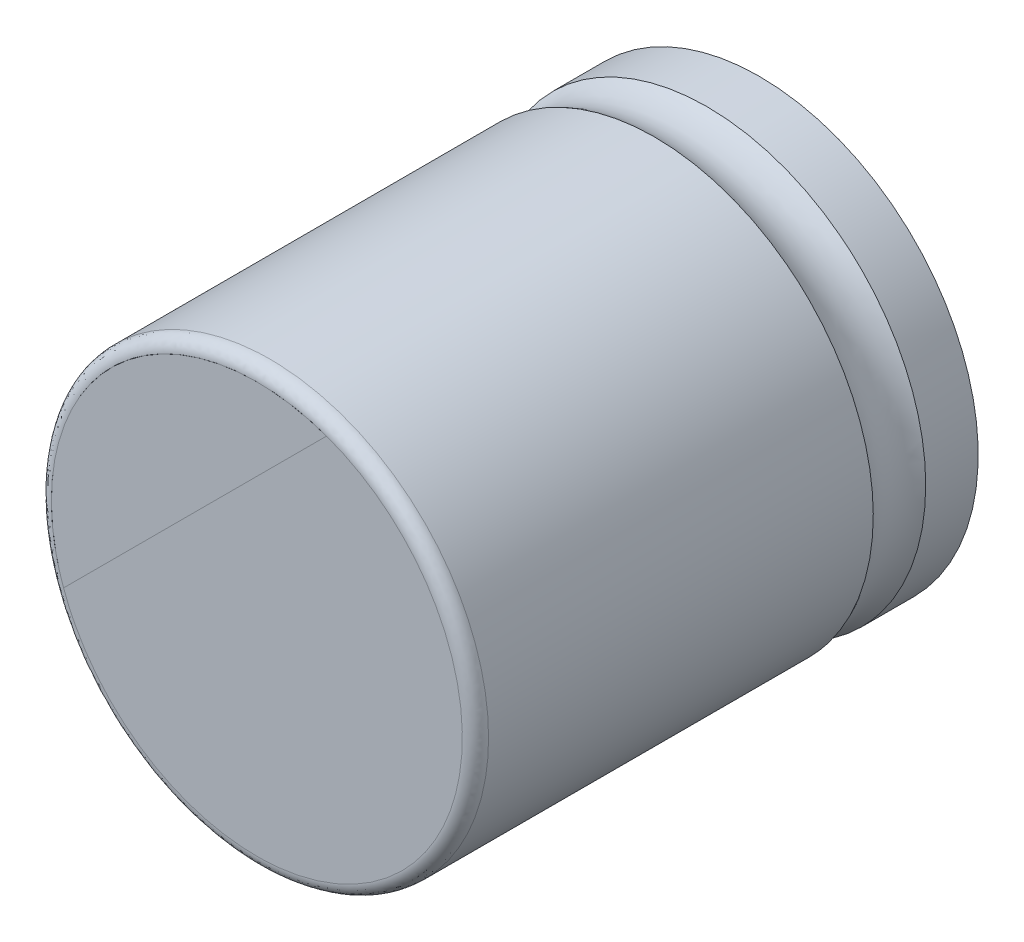
ISO-10303-21;
HEADER;
FILE_DESCRIPTION(('STEP AP214'),'2;1');
FILE_NAME('part.step','',(''),(''),'','','');
FILE_SCHEMA(('AUTOMOTIVE_DESIGN { 1 0 10303 214 1 1 1 1 }'));
ENDSEC;
DATA;
#1=APPLICATION_CONTEXT('core data for automotive mechanical design processes');
#2=APPLICATION_PROTOCOL_DEFINITION('international standard','automotive_design',2000,#1);
#3=PRODUCT_CONTEXT('',#1,'mechanical');
#4=PRODUCT('Part','Part','',(#3));
#5=PRODUCT_RELATED_PRODUCT_CATEGORY('part','',(#4));
#6=PRODUCT_DEFINITION_FORMATION('','',#4);
#7=PRODUCT_DEFINITION_CONTEXT('part definition',#1,'design');
#8=PRODUCT_DEFINITION('design','',#6,#7);
#9=PRODUCT_DEFINITION_SHAPE('','',#8);
#10=(LENGTH_UNIT() NAMED_UNIT(*) SI_UNIT(.MILLI.,.METRE.));
#11=(NAMED_UNIT(*) PLANE_ANGLE_UNIT() SI_UNIT($,.RADIAN.));
#12=(NAMED_UNIT(*) SI_UNIT($,.STERADIAN.) SOLID_ANGLE_UNIT());
#13=UNCERTAINTY_MEASURE_WITH_UNIT(LENGTH_MEASURE(1.E-05),#10,'distance_accuracy_value','');
#14=(GEOMETRIC_REPRESENTATION_CONTEXT(3) GLOBAL_UNCERTAINTY_ASSIGNED_CONTEXT((#13)) GLOBAL_UNIT_ASSIGNED_CONTEXT((#10,
#11,#12)) REPRESENTATION_CONTEXT('',''));
#15=CARTESIAN_POINT('',(0.,0.,0.));
#16=DIRECTION('',(0.,0.,1.));
#17=DIRECTION('',(1.,0.,0.));
#18=AXIS2_PLACEMENT_3D('',#15,#16,#17);
#19=CARTESIAN_POINT('',(-22.9845204221404,-6.4473216376947,14.5513158732941));
#20=CARTESIAN_POINT('',(-25.791467133841,-5.43589173098784,14.5513159287911));
#21=CARTESIAN_POINT('',(-27.9011993797086,-7.54562397685555,14.551316059209));
#22=CARTESIAN_POINT('',(-30.0109316255764,-9.65535622272346,14.5513161896269));
#23=CARTESIAN_POINT('',(-28.9995017188693,-12.4623029344242,14.5513162451239));
#24=CARTESIAN_POINT('',(-22.9845204221714,-6.44732163772561,14.5503158732941));
#25=CARTESIAN_POINT('',(-25.7914671338719,-5.43589173101874,14.5503159287911));
#26=CARTESIAN_POINT('',(-27.9011993797395,-7.54562397688646,14.5503160592089));
#27=CARTESIAN_POINT('',(-30.0109316256073,-9.65535622275437,14.5503161896268));
#28=CARTESIAN_POINT('',(-28.9995017189002,-12.4623029344551,14.5503162451238));
#29=(BOUNDED_SURFACE() B_SPLINE_SURFACE(1,2,((#19,#20,#21,#22,#23),(#24,#25,#26,#27,#28)),
.UNSPECIFIED.,.F.,.F.,.F.) B_SPLINE_SURFACE_WITH_KNOTS((2,2),(3,2,3),(0.425531914893605,
0.425744680851065),(-1.13124673434671,0.,1.13124673434683),
.UNSPECIFIED.) GEOMETRIC_REPRESENTATION_ITEM() RATIONAL_B_SPLINE_SURFACE(((1.,0.844254675703242,
1.,0.844254675703242,1.),(1.,0.844254675703242,1.,0.844254675703242,1.))) REPRESENTATION_ITEM('') SURFACE());
#30=CARTESIAN_POINT('',(-28.9995017189001,-12.4623029344551,14.5503162451239));
#31=CARTESIAN_POINT('',(-29.2777975081627,-11.6899691865893,14.5503162298538));
#32=CARTESIAN_POINT('',(-29.2777975081627,-10.8690258484632,14.5503162044796));
#33=(BOUNDED_CURVE() B_SPLINE_CURVE(2,(#30,#31,#32),.UNSPECIFIED.,.F.,
.F.) B_SPLINE_CURVE_WITH_KNOTS((3,3),(-0.345848570949383,0.),
.UNSPECIFIED.) CURVE() GEOMETRIC_REPRESENTATION_ITEM() RATIONAL_B_SPLINE_CURVE((1.,
0.985085816044448,1.)) REPRESENTATION_ITEM(''));
#34=CARTESIAN_POINT('',(-28.9995017189001,-12.4623029344551,14.5503162451238));
#35=VERTEX_POINT('',#34);
#36=CARTESIAN_POINT('',(-29.2777975081627,-10.8690258484632,14.5503162044796));
#37=VERTEX_POINT('',#36);
#38=EDGE_CURVE('E156',#35,#37,#33,.T.);
#39=CARTESIAN_POINT('',(-28.9995017189,-12.4623029344543,14.5503162451238));
#40=CARTESIAN_POINT('',(-28.9995017188691,-12.4623029344234,14.5513162451238));
#41=(BOUNDED_CURVE() B_SPLINE_CURVE(1,(#39,#40),.UNSPECIFIED.,.F.,
.F.) B_SPLINE_CURVE_WITH_KNOTS((2,2),(0.0019999999999999,0.0020009999999999),
.UNSPECIFIED.) CURVE() GEOMETRIC_REPRESENTATION_ITEM() RATIONAL_B_SPLINE_CURVE((1.,1.)) REPRESENTATION_ITEM(''));
#42=CARTESIAN_POINT('',(-28.9995017188691,-12.4623029344235,14.5513162451238));
#43=VERTEX_POINT('',#42);
#44=EDGE_CURVE('E11',#35,#43,#41,.T.);
#45=CARTESIAN_POINT('',(-22.9845204221406,-6.44732163769462,14.5513158732941));
#46=CARTESIAN_POINT('',(-25.7914671338411,-5.43589173098797,14.5513159287911));
#47=CARTESIAN_POINT('',(-27.9011993797086,-7.54562397685556,14.551316059209));
#48=CARTESIAN_POINT('',(-30.0109316255762,-9.65535622272316,14.5513161896269));
#49=CARTESIAN_POINT('',(-28.9995017188694,-12.4623029344236,14.5513162451239));
#50=(BOUNDED_CURVE() B_SPLINE_CURVE(2,(#45,#46,#47,#48,#49),.UNSPECIFIED.,.F.,
.F.) B_SPLINE_CURVE_WITH_KNOTS((3,2,3),(1.22494775584567,2.35619449019236,3.48744122453904),
.UNSPECIFIED.) CURVE() GEOMETRIC_REPRESENTATION_ITEM() RATIONAL_B_SPLINE_CURVE((1.,
0.844254675703262,1.,0.844254675703267,1.)) REPRESENTATION_ITEM(''));
#51=CARTESIAN_POINT('',(-22.9845204221407,-6.44732163769495,14.5513158732941));
#52=VERTEX_POINT('',#51);
#53=EDGE_CURVE('E121',#52,#43,#50,.T.);
#54=CARTESIAN_POINT('',(-22.9845204221715,-6.44732163772585,14.5503158732941));
#55=CARTESIAN_POINT('',(-22.9845204221406,-6.44732163769494,14.5513158732941));
#56=(BOUNDED_CURVE() B_SPLINE_CURVE(1,(#54,#55),.UNSPECIFIED.,.F.,
.F.) B_SPLINE_CURVE_WITH_KNOTS((2,2),(0.002,0.002001),
.UNSPECIFIED.) CURVE() GEOMETRIC_REPRESENTATION_ITEM() RATIONAL_B_SPLINE_CURVE((1.,1.)) REPRESENTATION_ITEM(''));
#57=CARTESIAN_POINT('',(-22.9845204221714,-6.44732163772573,14.5503158732941));
#58=VERTEX_POINT('',#57);
#59=EDGE_CURVE('E31',#58,#52,#56,.T.);
#60=CARTESIAN_POINT('',(-29.2777975081627,-10.8690258484632,14.5503162044796));
#61=CARTESIAN_POINT('',(-29.2777975081627,-8.42716342895958,14.5503161290049));
#62=CARTESIAN_POINT('',(-27.2797965547799,-7.02335280566826,14.5503160238596));
#63=CARTESIAN_POINT('',(-25.2817956013971,-5.61954218237694,14.5503159187142));
#64=CARTESIAN_POINT('',(-22.9845204221713,-6.44732163772557,14.5503158732941));
#65=(BOUNDED_CURVE() B_SPLINE_CURVE(2,(#60,#61,#62,#63,#64),.UNSPECIFIED.,.F.,
.F.) B_SPLINE_CURVE_WITH_KNOTS((3,2,3),(0.,0.958322448872076,1.91664489774415),
.UNSPECIFIED.) CURVE() GEOMETRIC_REPRESENTATION_ITEM() RATIONAL_B_SPLINE_CURVE((1.,
0.887381939802098,1.,0.887381939802095,1.)) REPRESENTATION_ITEM(''));
#66=EDGE_CURVE('E189',#37,#58,#65,.T.);
#67=ORIENTED_EDGE('',*,*,#38,.F.);
#68=ORIENTED_EDGE('',*,*,#44,.T.);
#69=ORIENTED_EDGE('',*,*,#53,.F.);
#70=ORIENTED_EDGE('',*,*,#59,.F.);
#71=ORIENTED_EDGE('',*,*,#66,.F.);
#72=EDGE_LOOP('',(#67,#68,#69,#70,#71));
#73=FACE_BOUND('',#72,.T.);
#74=ADVANCED_FACE('F17',(#73),#29,.T.);
#75=CARTESIAN_POINT('',(-29.6009998485764,-13.0638010641307,14.5502162823068));
#76=CARTESIAN_POINT('',(-29.6009998485394,-13.0638010640937,14.5514162823068));
#77=CARTESIAN_POINT('',(-22.3830222925016,-5.8458235080559,14.5502158361111));
#78=CARTESIAN_POINT('',(-22.3830222924645,-5.84582350801881,14.5514158361112));
#79=(BOUNDED_SURFACE() B_SPLINE_SURFACE(1,1,((#75,#76),(#77,#78)),.UNSPECIFIED.,.F.,.F.,
.F.) B_SPLINE_SURFACE_WITH_KNOTS((2,2),(2,2),(-0.000850646812726065,0.0093571149399796),
(0.00199989999999989,0.00200109999999997),
.UNSPECIFIED.) GEOMETRIC_REPRESENTATION_ITEM() RATIONAL_B_SPLINE_SURFACE(((1.,1.),(1.,1.))) REPRESENTATION_ITEM('') SURFACE());
#80=CARTESIAN_POINT('',(-22.9845204221714,-6.44732163772572,14.5503158732941));
#81=CARTESIAN_POINT('',(-28.9995017189004,-12.4623029344547,14.5503162451238));
#82=(BOUNDED_CURVE() B_SPLINE_CURVE(1,(#80,#81),.UNSPECIFIED.,.F.,
.F.) B_SPLINE_CURVE_WITH_KNOTS((2,2),(-0.00850646812725422,0.),
.UNSPECIFIED.) CURVE() GEOMETRIC_REPRESENTATION_ITEM() RATIONAL_B_SPLINE_CURVE((1.,1.)) REPRESENTATION_ITEM(''));
#83=EDGE_CURVE('E122',#58,#35,#82,.T.);
#84=CARTESIAN_POINT('',(-28.9995017188691,-12.4623029344234,14.5513162451239));
#85=CARTESIAN_POINT('',(-22.9845204221407,-6.44732163769497,14.5513158732941));
#86=(BOUNDED_CURVE() B_SPLINE_CURVE(1,(#84,#85),.UNSPECIFIED.,.F.,
.F.) B_SPLINE_CURVE_WITH_KNOTS((2,2),(-0.00425323406362698,0.00425323406362695),
.UNSPECIFIED.) CURVE() GEOMETRIC_REPRESENTATION_ITEM() RATIONAL_B_SPLINE_CURVE((1.,1.)) REPRESENTATION_ITEM(''));
#87=EDGE_CURVE('E112',#43,#52,#86,.T.);
#88=ORIENTED_EDGE('',*,*,#83,.F.);
#89=ORIENTED_EDGE('',*,*,#59,.T.);
#90=ORIENTED_EDGE('',*,*,#87,.F.);
#91=ORIENTED_EDGE('',*,*,#44,.F.);
#92=EDGE_LOOP('',(#88,#89,#90,#91));
#93=FACE_BOUND('',#92,.T.);
#94=ADVANCED_FACE('F175',(#93),#79,.T.);
#95=CARTESIAN_POINT('',(-29.4100810176219,-13.2547198950169,14.5513162823068));
#96=CARTESIAN_POINT('',(-31.7011069886663,-10.9636939239725,14.5513162823068));
#97=CARTESIAN_POINT('',(-22.1921034615472,-6.03674233894222,14.5513158361112));
#98=CARTESIAN_POINT('',(-24.4831294325916,-3.74571636789779,14.5513158361112));
#99=(BOUNDED_SURFACE() B_SPLINE_SURFACE(1,1,((#95,#96),(#97,#98)),.UNSPECIFIED.,.F.,.F.,
.F.) B_SPLINE_SURFACE_WITH_KNOTS((2,2),(2,2),(-0.00510388087635276,0.00510388087635273),
(-0.001121530868032,0.00211846913196803),
.UNSPECIFIED.) GEOMETRIC_REPRESENTATION_ITEM() RATIONAL_B_SPLINE_SURFACE(((1.,1.),(1.,1.))) REPRESENTATION_ITEM('') SURFACE());
#100=ORIENTED_EDGE('',*,*,#87,.T.);
#101=ORIENTED_EDGE('',*,*,#53,.T.);
#102=EDGE_LOOP('',(#100,#101));
#103=FACE_BOUND('',#102,.T.);
#104=ADVANCED_FACE('F174',(#103),#99,.T.);
#105=CARTESIAN_POINT('',(-24.6072322844941,-20.5101500175862,14.5503163581128));
#106=CARTESIAN_POINT('',(-31.3927503849693,-13.724631917111,14.5503163581128));
#107=CARTESIAN_POINT('',(-14.9366733390395,-10.8395910721317,14.5503157603052));
#108=CARTESIAN_POINT('',(-21.7221914395147,-4.05407297165644,14.5503157603052));
#109=(BOUNDED_SURFACE() B_SPLINE_SURFACE(1,1,((#105,#106),(#107,#108)),.UNSPECIFIED.,.F.,.F.,
.F.) B_SPLINE_SURFACE_WITH_KNOTS((2,2),(2,2),(-0.00683811780819507,0.00683811780819527),
(-0.00964802161633376,-5.18498909135971E-05),
.UNSPECIFIED.) GEOMETRIC_REPRESENTATION_ITEM() RATIONAL_B_SPLINE_SURFACE(((1.,1.),(1.,1.))) REPRESENTATION_ITEM('') SURFACE());
#110=CARTESIAN_POINT('',(-22.9845204221713,-6.44732163772557,14.5503158732941));
#111=CARTESIAN_POINT('',(-19.4805768587286,-7.70990111481567,14.5503158040166));
#112=CARTESIAN_POINT('',(-19.9089947561008,-11.4096559089841,14.5503159316128));
#113=CARTESIAN_POINT('',(-20.3374126534729,-15.1094107031525,14.550316059209));
#114=CARTESIAN_POINT('',(-24.0371674476412,-15.5378286005251,14.5503161868052));
#115=CARTESIAN_POINT('',(-27.7369222418096,-15.9662464978977,14.5503163144014));
#116=CARTESIAN_POINT('',(-28.9995017189001,-12.4623029344551,14.5503162451239));
#117=(BOUNDED_CURVE() B_SPLINE_CURVE(2,(#110,#111,#112,#113,#114,#115,#116),.UNSPECIFIED.,.F.,
.F.) B_SPLINE_CURVE_WITH_KNOTS((3,2,2,3),(-1.22494775584564,0.115282856983045,1.45551346981173,
2.79574408264041),
.UNSPECIFIED.) CURVE() GEOMETRIC_REPRESENTATION_ITEM() RATIONAL_B_SPLINE_CURVE((1.,
0.783750057002811,1.,0.783750057002807,1.,0.783750057002809,1.)) REPRESENTATION_ITEM(''));
#118=EDGE_CURVE('E23',#58,#35,#117,.T.);
#119=ORIENTED_EDGE('',*,*,#83,.T.);
#120=ORIENTED_EDGE('',*,*,#118,.F.);
#121=EDGE_LOOP('',(#119,#120));
#122=FACE_BOUND('',#121,.T.);
#123=ADVANCED_FACE('F180',(#122),#109,.T.);
#124=CARTESIAN_POINT('',(-29.2777975081627,-10.8690258484632,14.5503162044796));
#125=CARTESIAN_POINT('',(-29.2777975081627,-15.5690258484632,14.5503163497502));
#126=CARTESIAN_POINT('',(-24.5777975081627,-15.5690258484632,14.5503162044796));
#127=CARTESIAN_POINT('',(-19.8777975081627,-15.5690258484632,14.550316059209));
#128=CARTESIAN_POINT('',(-19.8777975081627,-10.8690258484632,14.5503159139384));
#129=CARTESIAN_POINT('',(-19.8777975081627,-6.16902584846323,14.5503157686678));
#130=CARTESIAN_POINT('',(-24.5777975081627,-6.16902584846323,14.5503159139384));
#131=CARTESIAN_POINT('',(-29.2777975081627,-6.16902584846323,14.550316059209));
#132=CARTESIAN_POINT('',(-29.2777975081627,-10.8690258484632,14.5503162044796));
#133=CARTESIAN_POINT('',(-29.5777975081627,-10.8690258484632,14.5503162137522));
#134=CARTESIAN_POINT('',(-29.5777975081627,-15.8690258484632,14.5503163682954));
#135=CARTESIAN_POINT('',(-24.5777975081627,-15.8690258484632,14.5503162137522));
#136=CARTESIAN_POINT('',(-19.5777975081627,-15.8690258484632,14.550316059209));
#137=CARTESIAN_POINT('',(-19.5777975081627,-10.8690258484632,14.5503159046658));
#138=CARTESIAN_POINT('',(-19.5777975081627,-5.86902584846321,14.5503157501227));
#139=CARTESIAN_POINT('',(-24.5777975081627,-5.86902584846321,14.5503159046658));
#140=CARTESIAN_POINT('',(-29.5777975081627,-5.86902584846321,14.550316059209));
#141=CARTESIAN_POINT('',(-29.5777975081627,-10.8690258484632,14.5503162137522));
#142=CARTESIAN_POINT('',(-29.5777975174353,-10.8690258577358,14.2503162137522));
#143=CARTESIAN_POINT('',(-29.5777975174353,-15.8690258577358,14.2503163682953));
#144=CARTESIAN_POINT('',(-24.5777975174353,-15.8690258577358,14.2503162137522));
#145=CARTESIAN_POINT('',(-19.5777975174353,-15.8690258577358,14.250316059209));
#146=CARTESIAN_POINT('',(-19.5777975174353,-10.8690258577358,14.2503159046658));
#147=CARTESIAN_POINT('',(-19.5777975174353,-5.8690258577358,14.2503157501227));
#148=CARTESIAN_POINT('',(-24.5777975174353,-5.8690258577358,14.2503159046658));
#149=CARTESIAN_POINT('',(-29.5777975174353,-5.8690258577358,14.250316059209));
#150=CARTESIAN_POINT('',(-29.5777975174353,-10.8690258577358,14.2503162137522));
#151=(BOUNDED_SURFACE() B_SPLINE_SURFACE(2,2,((#124,#125,#126,#127,#128,#129,#130,#131,#132),
(#133,#134,#135,#136,#137,#138,#139,#140,#141),(#142,#143,#144,#145,#146,#147,#148,#149,#150)),
.UNSPECIFIED.,.F.,.T.,.F.) B_SPLINE_SURFACE_WITH_KNOTS((3,3),(3,2,2,2,3),(0.,1.57079632679494),
(-3.14159265358979,-1.5707963267949,0.,1.5707963267949,3.14159265358979),
.UNSPECIFIED.) GEOMETRIC_REPRESENTATION_ITEM() RATIONAL_B_SPLINE_SURFACE(((1.,0.707106781186548,
1.,0.707106781186548,1.,0.707106781186548,1.,0.707106781186548,1.),(0.707106781186524,
0.499999999999984,0.707106781186524,0.499999999999984,0.707106781186524,0.499999999999984,
0.707106781186524,0.499999999999984,0.707106781186524),(1.,0.707106781186548,1.,
0.707106781186548,1.,0.707106781186548,1.,0.707106781186548,1.))) REPRESENTATION_ITEM('') SURFACE());
#152=CARTESIAN_POINT('',(-29.2777975081627,-10.8690258484632,14.5503162044796));
#153=CARTESIAN_POINT('',(-29.5777975081627,-10.8690258484632,14.5503162137522));
#154=CARTESIAN_POINT('',(-29.5777975174353,-10.8690258577358,14.2503162137522));
#155=(BOUNDED_CURVE() B_SPLINE_CURVE(2,(#152,#153,#154),.UNSPECIFIED.,.F.,
.F.) B_SPLINE_CURVE_WITH_KNOTS((3,3),(-1.57079632679494,0.),
.UNSPECIFIED.) CURVE() GEOMETRIC_REPRESENTATION_ITEM() RATIONAL_B_SPLINE_CURVE((1.,
0.707106781186524,1.)) REPRESENTATION_ITEM(''));
#156=CARTESIAN_POINT('',(-29.5777975174353,-10.8690258577358,14.2503162137522));
#157=VERTEX_POINT('',#156);
#158=EDGE_CURVE('E192',#37,#157,#155,.T.);
#159=CARTESIAN_POINT('',(-29.5777975174353,-10.8690258577358,14.2503162137522));
#160=CARTESIAN_POINT('',(-29.5777975174353,-14.2099190473323,14.2503163170146));
#161=CARTESIAN_POINT('',(-26.4912146792607,-15.4884235202922,14.2503162611294));
#162=CARTESIAN_POINT('',(-23.4046318410862,-16.7669279932522,14.2503162052442));
#163=CARTESIAN_POINT('',(-21.0422636115025,-14.4045597636685,14.250316059209));
#164=(BOUNDED_CURVE() B_SPLINE_CURVE(2,(#159,#160,#161,#162,#163),.UNSPECIFIED.,.F.,
.F.) B_SPLINE_CURVE_WITH_KNOTS((3,2,3),(3.14159265358979,4.31968989868597,5.49778714378215),
.UNSPECIFIED.) CURVE() GEOMETRIC_REPRESENTATION_ITEM() RATIONAL_B_SPLINE_CURVE((1.,
0.831469612302543,1.,0.831469612302544,1.)) REPRESENTATION_ITEM(''));
#165=CARTESIAN_POINT('',(-21.0422636115025,-14.4045597636685,14.250316059209));
#166=VERTEX_POINT('',#165);
#167=EDGE_CURVE('E130',#157,#166,#164,.T.);
#168=CARTESIAN_POINT('',(-21.0422636115025,-14.4045597636685,14.250316059209));
#169=CARTESIAN_POINT('',(-19.5777975174353,-12.9400936696013,14.2503159686797));
#170=CARTESIAN_POINT('',(-19.5777975174353,-10.8690258577358,14.2503159046658));
#171=(BOUNDED_CURVE() B_SPLINE_CURVE(2,(#168,#169,#170),.UNSPECIFIED.,.F.,
.F.) B_SPLINE_CURVE_WITH_KNOTS((3,3),(5.49778714378215,6.28318530717959),
.UNSPECIFIED.) CURVE() GEOMETRIC_REPRESENTATION_ITEM() RATIONAL_B_SPLINE_CURVE((1.,
0.923879532511279,1.)) REPRESENTATION_ITEM(''));
#172=CARTESIAN_POINT('',(-19.5777975174353,-10.8690258577358,14.2503159046658));
#173=VERTEX_POINT('',#172);
#174=EDGE_CURVE('E148',#166,#173,#171,.T.);
#175=CARTESIAN_POINT('',(-19.5777975174353,-10.8690258577358,14.2503159046658));
#176=CARTESIAN_POINT('',(-19.5777975174353,-5.8690258577358,14.2503157501227));
#177=CARTESIAN_POINT('',(-24.5777975174353,-5.8690258577358,14.2503159046658));
#178=CARTESIAN_POINT('',(-29.5777975174353,-5.8690258577358,14.250316059209));
#179=CARTESIAN_POINT('',(-29.5777975174353,-10.8690258577358,14.2503162137522));
#180=(BOUNDED_CURVE() B_SPLINE_CURVE(2,(#175,#176,#177,#178,#179),.UNSPECIFIED.,.F.,
.F.) B_SPLINE_CURVE_WITH_KNOTS((3,2,3),(0.,1.5707963267949,3.14159265358979),
.UNSPECIFIED.) CURVE() GEOMETRIC_REPRESENTATION_ITEM() RATIONAL_B_SPLINE_CURVE((1.,
0.707106781186547,1.,0.707106781186547,1.)) REPRESENTATION_ITEM(''));
#181=EDGE_CURVE('E139',#173,#157,#180,.T.);
#182=ORIENTED_EDGE('',*,*,#38,.T.);
#183=ORIENTED_EDGE('',*,*,#158,.T.);
#184=ORIENTED_EDGE('',*,*,#167,.T.);
#185=ORIENTED_EDGE('',*,*,#174,.T.);
#186=ORIENTED_EDGE('',*,*,#181,.T.);
#187=ORIENTED_EDGE('',*,*,#158,.F.);
#188=ORIENTED_EDGE('',*,*,#66,.T.);
#189=ORIENTED_EDGE('',*,*,#118,.T.);
#190=EDGE_LOOP('',(#182,#183,#184,#185,#186,#187,#188,#189));
#191=FACE_BOUND('',#190,.T.);
#192=ADVANCED_FACE('F186',(#191),#151,.T.);
#193=CARTESIAN_POINT('',(-21.0422638834985,-14.4045600356645,5.45031605920899));
#194=CARTESIAN_POINT('',(-24.5777977894312,-17.9400939415972,5.45031627776605));
#195=CARTESIAN_POINT('',(-28.113331695364,-14.4045600356645,5.45031627776605));
#196=CARTESIAN_POINT('',(-31.6488656012967,-10.8690261297318,5.45031627776605));
#197=CARTESIAN_POINT('',(-28.113331695364,-7.33349222379902,5.450316059209));
#198=CARTESIAN_POINT('',(-24.5777977894313,-3.79795831786628,5.45031584065195));
#199=CARTESIAN_POINT('',(-21.0422638834985,-7.33349222379902,5.45031584065195));
#200=CARTESIAN_POINT('',(-17.5067299775658,-10.8690261297318,5.45031584065194));
#201=CARTESIAN_POINT('',(-21.0422638834985,-14.4045600356645,5.45031605920899));
#202=CARTESIAN_POINT('',(-21.0422636115025,-14.4045597636685,14.250316059209));
#203=CARTESIAN_POINT('',(-24.5777975174353,-17.9400936696012,14.2503162777661));
#204=CARTESIAN_POINT('',(-28.113331423368,-14.4045597636685,14.2503162777661));
#205=CARTESIAN_POINT('',(-31.6488653293007,-10.8690258577358,14.2503162777661));
#206=CARTESIAN_POINT('',(-28.113331423368,-7.33349195180303,14.250316059209));
#207=CARTESIAN_POINT('',(-24.5777975174353,-3.7979580458703,14.250315840652));
#208=CARTESIAN_POINT('',(-21.0422636115025,-7.33349195180303,14.250315840652));
#209=CARTESIAN_POINT('',(-17.5067297055698,-10.8690258577358,14.250315840652));
#210=CARTESIAN_POINT('',(-21.0422636115025,-14.4045597636685,14.250316059209));
#211=(BOUNDED_SURFACE() B_SPLINE_SURFACE(1,2,((#193,#194,#195,#196,#197,#198,#199,#200,#201),
(#202,#203,#204,#205,#206,#207,#208,#209,#210)),.UNSPECIFIED.,.F.,.T.,
.F.) B_SPLINE_SURFACE_WITH_KNOTS((2,2),(3,2,2,2,3),(-1.05,0.71),(-3.14159265358979,
-1.5707963267949,0.,1.5707963267949,3.14159265358979),
.UNSPECIFIED.) GEOMETRIC_REPRESENTATION_ITEM() RATIONAL_B_SPLINE_SURFACE(((1.,0.707106781186548,
1.,0.707106781186548,1.,0.707106781186548,1.,0.707106781186548,1.),(1.,0.707106781186548,1.,
0.707106781186548,1.,0.707106781186548,1.,0.707106781186548,1.))) REPRESENTATION_ITEM('') SURFACE());
#212=CARTESIAN_POINT('',(-28.113331695364,-7.33349222379904,5.450316059209));
#213=CARTESIAN_POINT('',(-24.5777977894312,-3.7979583178663,5.45031584065195));
#214=CARTESIAN_POINT('',(-21.0422638834985,-7.33349222379911,5.45031584065195));
#215=(BOUNDED_CURVE() B_SPLINE_CURVE(2,(#212,#213,#214),.UNSPECIFIED.,.F.,
.F.) B_SPLINE_CURVE_WITH_KNOTS((3,3),(0.,1.57079632679491),
.UNSPECIFIED.) CURVE() GEOMETRIC_REPRESENTATION_ITEM() RATIONAL_B_SPLINE_CURVE((1.,
0.707106781186544,1.)) REPRESENTATION_ITEM(''));
#216=CARTESIAN_POINT('',(-28.113331695364,-7.33349222379906,5.450316059209));
#217=VERTEX_POINT('',#216);
#218=CARTESIAN_POINT('',(-21.0422638834984,-7.33349222379903,5.45031584065196));
#219=VERTEX_POINT('',#218);
#220=EDGE_CURVE('E223',#217,#219,#215,.T.);
#221=CARTESIAN_POINT('',(-21.0422638834985,-14.4045600356645,5.450316059209));
#222=CARTESIAN_POINT('',(-24.5777977894312,-17.9400939415973,5.45031627776605));
#223=CARTESIAN_POINT('',(-28.113331695364,-14.4045600356645,5.45031627776605));
#224=CARTESIAN_POINT('',(-31.6488656012968,-10.8690261297318,5.45031627776605));
#225=CARTESIAN_POINT('',(-28.113331695364,-7.33349222379904,5.450316059209));
#226=(BOUNDED_CURVE() B_SPLINE_CURVE(2,(#221,#222,#223,#224,#225),.UNSPECIFIED.,.F.,
.F.) B_SPLINE_CURVE_WITH_KNOTS((3,2,3),(3.14159265358978,4.71238898038469,6.28318530717959),
.UNSPECIFIED.) CURVE() GEOMETRIC_REPRESENTATION_ITEM() RATIONAL_B_SPLINE_CURVE((1.,
0.707106781186544,1.,0.707106781186544,1.)) REPRESENTATION_ITEM(''));
#227=CARTESIAN_POINT('',(-21.0422638834985,-14.4045600356645,5.45031605920899));
#228=VERTEX_POINT('',#227);
#229=EDGE_CURVE('E226',#228,#217,#226,.T.);
#230=CARTESIAN_POINT('',(-21.0422638834985,-14.4045600356645,5.45031605920899));
#231=CARTESIAN_POINT('',(-21.0422636115025,-14.4045597636685,14.250316059209));
#232=(BOUNDED_CURVE() B_SPLINE_CURVE(1,(#230,#231),.UNSPECIFIED.,.F.,
.F.) B_SPLINE_CURVE_WITH_KNOTS((2,2),(-0.71,1.05),
.UNSPECIFIED.) CURVE() GEOMETRIC_REPRESENTATION_ITEM() RATIONAL_B_SPLINE_CURVE((1.,1.)) REPRESENTATION_ITEM(''));
#233=EDGE_CURVE('E140',#228,#166,#232,.T.);
#234=CARTESIAN_POINT('',(-21.0422638834985,-7.33349222379911,5.45031584065195));
#235=CARTESIAN_POINT('',(-17.5067299775659,-10.8690261297318,5.45031584065195));
#236=CARTESIAN_POINT('',(-21.0422638834985,-14.4045600356645,5.450316059209));
#237=(BOUNDED_CURVE() B_SPLINE_CURVE(2,(#234,#235,#236),.UNSPECIFIED.,.F.,
.F.) B_SPLINE_CURVE_WITH_KNOTS((3,3),(1.57079632679491,3.14159265358978),
.UNSPECIFIED.) CURVE() GEOMETRIC_REPRESENTATION_ITEM() RATIONAL_B_SPLINE_CURVE((1.,
0.707106781186557,1.)) REPRESENTATION_ITEM(''));
#238=EDGE_CURVE('E108',#219,#228,#237,.T.);
#239=ORIENTED_EDGE('',*,*,#220,.F.);
#240=ORIENTED_EDGE('',*,*,#229,.F.);
#241=ORIENTED_EDGE('',*,*,#233,.T.);
#242=ORIENTED_EDGE('',*,*,#167,.F.);
#243=ORIENTED_EDGE('',*,*,#181,.F.);
#244=ORIENTED_EDGE('',*,*,#174,.F.);
#245=ORIENTED_EDGE('',*,*,#233,.F.);
#246=ORIENTED_EDGE('',*,*,#238,.F.);
#247=EDGE_LOOP('',(#239,#240,#241,#242,#243,#244,#245,#246));
#248=FACE_BOUND('',#247,.T.);
#249=ADVANCED_FACE('F19',(#248),#211,.T.);
#250=CARTESIAN_POINT('',(-21.0422639205888,-7.33349226088943,4.25031584065204));
#251=CARTESIAN_POINT('',(-17.5067300146561,-10.8690261668222,4.25031584065204));
#252=CARTESIAN_POINT('',(-21.0422639205888,-14.4045600727549,4.25031605920909));
#253=CARTESIAN_POINT('',(-24.5777978265216,-17.9400939786877,4.25031627776613));
#254=CARTESIAN_POINT('',(-28.1133317324543,-14.4045600727549,4.25031627776614));
#255=CARTESIAN_POINT('',(-31.6488656383871,-10.8690261668222,4.25031627776614));
#256=CARTESIAN_POINT('',(-28.1133317324543,-7.33349226088943,4.25031605920909));
#257=CARTESIAN_POINT('',(-24.5777978265216,-3.79795835495667,4.25031584065204));
#258=CARTESIAN_POINT('',(-21.0422639205888,-7.33349226088943,4.25031584065204));
#259=CARTESIAN_POINT('',(-21.312762435416,-7.60399077571664,4.8503158573735));
#260=CARTESIAN_POINT('',(-18.0477270628557,-10.869026148277,4.8503158573735));
#261=CARTESIAN_POINT('',(-21.312762435416,-14.1340615208374,4.85031605920906));
#262=CARTESIAN_POINT('',(-24.5777978079764,-17.3990968933977,4.85031626104463));
#263=CARTESIAN_POINT('',(-27.8428331805368,-14.1340615208374,4.85031626104464));
#264=CARTESIAN_POINT('',(-31.1078685530971,-10.869026148277,4.85031626104464));
#265=CARTESIAN_POINT('',(-27.8428331805368,-7.60399077571664,4.85031605920907));
#266=CARTESIAN_POINT('',(-24.5777978079764,-4.33895540315628,4.8503158573735));
#267=CARTESIAN_POINT('',(-21.312762435416,-7.60399077571664,4.8503158573735));
#268=CARTESIAN_POINT('',(-21.0422638834984,-7.33349222379903,5.45031584065196));
#269=CARTESIAN_POINT('',(-17.5067299775656,-10.8690261297318,5.45031584065195));
#270=CARTESIAN_POINT('',(-21.0422638834984,-14.4045600356646,5.450316059209));
#271=CARTESIAN_POINT('',(-24.5777977894312,-17.9400939415974,5.45031627776606));
#272=CARTESIAN_POINT('',(-28.113331695364,-14.4045600356646,5.45031627776606));
#273=CARTESIAN_POINT('',(-31.6488656012968,-10.8690261297318,5.45031627776606));
#274=CARTESIAN_POINT('',(-28.113331695364,-7.33349222379902,5.45031605920901));
#275=CARTESIAN_POINT('',(-24.5777977894312,-3.79795831786623,5.45031584065196));
#276=CARTESIAN_POINT('',(-21.0422638834984,-7.33349222379903,5.45031584065196));
#277=(BOUNDED_SURFACE() B_SPLINE_SURFACE(2,2,((#250,#251,#252,#253,#254,#255,#256,#257,#258),
(#259,#260,#261,#262,#263,#264,#265,#266,#267),(#268,#269,#270,#271,#272,#273,#274,#275,#276)),
.UNSPECIFIED.,.F.,.T.,.F.) B_SPLINE_SURFACE_WITH_KNOTS((3,3),(3,2,2,2,3),(-3.7091808720066,
-2.57400443517288),(-3.14159265358979,-1.5707963267949,0.,1.5707963267949,3.14159265358979),
.UNSPECIFIED.) GEOMETRIC_REPRESENTATION_ITEM() RATIONAL_B_SPLINE_SURFACE(((1.,0.707106781186548,
1.,0.707106781186548,1.,0.707106781186548,1.,0.707106781186548,1.),(0.8431999999999,
0.596232437896426,0.8431999999999,0.596232437896426,0.8431999999999,0.596232437896426,
0.8431999999999,0.596232437896426,0.8431999999999),(1.,0.707106781186548,1.,0.707106781186548,
1.,0.707106781186548,1.,0.707106781186548,1.))) REPRESENTATION_ITEM('') SURFACE());
#278=CARTESIAN_POINT('',(-21.0422639205889,-14.4045600727549,4.25031605920913));
#279=CARTESIAN_POINT('',(-24.5777978265217,-17.9400939786876,4.25031627776618));
#280=CARTESIAN_POINT('',(-28.1133317324544,-14.4045600727548,4.25031627776618));
#281=CARTESIAN_POINT('',(-31.6488656383871,-10.869026166822,4.25031627776618));
#282=CARTESIAN_POINT('',(-28.1133317324543,-7.33349226088931,4.25031605920913));
#283=CARTESIAN_POINT('',(-24.5777978265215,-3.79795835495663,4.25031584065208));
#284=CARTESIAN_POINT('',(-21.0422639205888,-7.33349226088941,4.25031584065208));
#285=(BOUNDED_CURVE() B_SPLINE_CURVE(2,(#278,#279,#280,#281,#282,#283,#284),.UNSPECIFIED.,.F.,
.F.) B_SPLINE_CURVE_WITH_KNOTS((3,2,2,3),(0.,1.57079632679491,3.14159265358981,4.7123889803847),
.UNSPECIFIED.) CURVE() GEOMETRIC_REPRESENTATION_ITEM() RATIONAL_B_SPLINE_CURVE((1.,
0.707106781186547,1.,0.707106781186547,1.,0.707106781186547,1.)) REPRESENTATION_ITEM(''));
#286=CARTESIAN_POINT('',(-21.0422639205889,-14.4045600727549,4.25031605920912));
#287=VERTEX_POINT('',#286);
#288=CARTESIAN_POINT('',(-21.0422639205888,-7.33349226088943,4.25031584065204));
#289=VERTEX_POINT('',#288);
#290=EDGE_CURVE('E85',#287,#289,#285,.T.);
#291=CARTESIAN_POINT('',(-21.0422639205888,-7.33349226088941,4.25031584065208));
#292=CARTESIAN_POINT('',(-17.5067300146561,-10.8690261668222,4.25031584065208));
#293=CARTESIAN_POINT('',(-21.0422639205889,-14.4045600727549,4.25031605920913));
#294=(BOUNDED_CURVE() B_SPLINE_CURVE(2,(#291,#292,#293),.UNSPECIFIED.,.F.,
.F.) B_SPLINE_CURVE_WITH_KNOTS((3,3),(4.7123889803847,6.2831853071796),
.UNSPECIFIED.) CURVE() GEOMETRIC_REPRESENTATION_ITEM() RATIONAL_B_SPLINE_CURVE((1.,
0.707106781186546,1.)) REPRESENTATION_ITEM(''));
#295=EDGE_CURVE('E78',#289,#287,#294,.T.);
#296=CARTESIAN_POINT('',(-21.0422639205888,-7.33349226088943,4.25031584065204));
#297=CARTESIAN_POINT('',(-21.312762435416,-7.60399077571664,4.8503158573735));
#298=CARTESIAN_POINT('',(-21.0422638834984,-7.33349222379903,5.45031584065196));
#299=(BOUNDED_CURVE() B_SPLINE_CURVE(2,(#296,#297,#298),.UNSPECIFIED.,.F.,
.F.) B_SPLINE_CURVE_WITH_KNOTS((3,3),(-3.7091808720066,-2.57400443517288),
.UNSPECIFIED.) CURVE() GEOMETRIC_REPRESENTATION_ITEM() RATIONAL_B_SPLINE_CURVE((1.,
0.8431999999999,1.)) REPRESENTATION_ITEM(''));
#300=EDGE_CURVE('E89',#289,#219,#299,.T.);
#301=ORIENTED_EDGE('',*,*,#290,.F.);
#302=ORIENTED_EDGE('',*,*,#295,.F.);
#303=ORIENTED_EDGE('',*,*,#300,.T.);
#304=ORIENTED_EDGE('',*,*,#238,.T.);
#305=ORIENTED_EDGE('',*,*,#229,.T.);
#306=ORIENTED_EDGE('',*,*,#220,.T.);
#307=ORIENTED_EDGE('',*,*,#300,.F.);
#308=EDGE_LOOP('',(#301,#302,#303,#304,#305,#306,#307));
#309=FACE_BOUND('',#308,.T.);
#310=ADVANCED_FACE('F91',(#309),#277,.T.);
#311=CARTESIAN_POINT('',(-21.0422639576792,-14.4045601098452,3.050316059209));
#312=CARTESIAN_POINT('',(-24.577797863612,-17.9400940157779,3.05031627776604));
#313=CARTESIAN_POINT('',(-28.1133317695447,-14.4045601098452,3.05031627776605));
#314=CARTESIAN_POINT('',(-31.6488656754774,-10.8690262039125,3.05031627776605));
#315=CARTESIAN_POINT('',(-28.1133317695447,-7.33349229797974,3.050316059209));
#316=CARTESIAN_POINT('',(-24.577797863612,-3.797958392047,3.05031584065195));
#317=CARTESIAN_POINT('',(-21.0422639576792,-7.33349229797974,3.05031584065195));
#318=CARTESIAN_POINT('',(-17.5067300517465,-10.8690262039125,3.05031584065195));
#319=CARTESIAN_POINT('',(-21.0422639576792,-14.4045601098452,3.050316059209));
#320=CARTESIAN_POINT('',(-21.0422639205889,-14.4045600727549,4.25031605920913));
#321=CARTESIAN_POINT('',(-24.5777978265216,-17.9400939786876,4.25031627776618));
#322=CARTESIAN_POINT('',(-28.1133317324543,-14.4045600727548,4.25031627776618));
#323=CARTESIAN_POINT('',(-31.6488656383871,-10.8690261668221,4.25031627776618));
#324=CARTESIAN_POINT('',(-28.1133317324544,-7.33349226088938,4.25031605920913));
#325=CARTESIAN_POINT('',(-24.5777978265216,-3.79795835495664,4.25031584065208));
#326=CARTESIAN_POINT('',(-21.0422639205889,-7.33349226088938,4.25031584065208));
#327=CARTESIAN_POINT('',(-17.5067300146561,-10.8690261668221,4.25031584065208));
#328=CARTESIAN_POINT('',(-21.0422639205889,-14.4045600727549,4.25031605920913));
#329=(BOUNDED_SURFACE() B_SPLINE_SURFACE(1,2,((#311,#312,#313,#314,#315,#316,#317,#318,#319),
(#320,#321,#322,#323,#324,#325,#326,#327,#328)),.UNSPECIFIED.,.F.,.T.,
.F.) B_SPLINE_SURFACE_WITH_KNOTS((2,2),(3,2,2,2,3),(0.949999999999975,1.19),(-3.14159265358979,
-1.5707963267949,0.,1.5707963267949,3.14159265358979),
.UNSPECIFIED.) GEOMETRIC_REPRESENTATION_ITEM() RATIONAL_B_SPLINE_SURFACE(((1.,0.707106781186548,
1.,0.707106781186548,1.,0.707106781186548,1.,0.707106781186548,1.),(1.,0.707106781186548,1.,
0.707106781186548,1.,0.707106781186548,1.,0.707106781186548,1.))) REPRESENTATION_ITEM('') SURFACE());
#330=CARTESIAN_POINT('',(-28.1133317695447,-7.33349229797974,3.050316059209));
#331=CARTESIAN_POINT('',(-24.577797863612,-3.79795839204705,3.05031584065195));
#332=CARTESIAN_POINT('',(-21.0422639576793,-7.33349229797976,3.05031584065195));
#333=CARTESIAN_POINT('',(-17.5067300517466,-10.8690262039125,3.05031584065195));
#334=CARTESIAN_POINT('',(-21.0422639576792,-14.4045601098452,3.050316059209));
#335=(BOUNDED_CURVE() B_SPLINE_CURVE(2,(#330,#331,#332,#333,#334),.UNSPECIFIED.,.F.,
.F.) B_SPLINE_CURVE_WITH_KNOTS((3,2,3),(0.,1.5707963267949,3.14159265358979),
.UNSPECIFIED.) CURVE() GEOMETRIC_REPRESENTATION_ITEM() RATIONAL_B_SPLINE_CURVE((1.,
0.70710678118655,1.,0.70710678118655,1.)) REPRESENTATION_ITEM(''));
#336=CARTESIAN_POINT('',(-28.1133317695447,-7.33349229797976,3.050316059209));
#337=VERTEX_POINT('',#336);
#338=CARTESIAN_POINT('',(-21.0422639576792,-14.4045601098452,3.050316059209));
#339=VERTEX_POINT('',#338);
#340=EDGE_CURVE('E103',#337,#339,#335,.T.);
#341=CARTESIAN_POINT('',(-21.0422639576792,-14.4045601098452,3.050316059209));
#342=CARTESIAN_POINT('',(-24.577797863612,-17.940094015778,3.05031627776605));
#343=CARTESIAN_POINT('',(-28.1133317695447,-14.4045601098452,3.05031627776605));
#344=CARTESIAN_POINT('',(-31.6488656754775,-10.8690262039125,3.05031627776605));
#345=CARTESIAN_POINT('',(-28.1133317695447,-7.33349229797974,3.050316059209));
#346=(BOUNDED_CURVE() B_SPLINE_CURVE(2,(#341,#342,#343,#344,#345),.UNSPECIFIED.,.F.,
.F.) B_SPLINE_CURVE_WITH_KNOTS((3,2,3),(3.14159265358979,4.71238898038469,6.28318530717959),
.UNSPECIFIED.) CURVE() GEOMETRIC_REPRESENTATION_ITEM() RATIONAL_B_SPLINE_CURVE((1.,
0.707106781186545,1.,0.707106781186543,1.)) REPRESENTATION_ITEM(''));
#347=EDGE_CURVE('E95',#339,#337,#346,.T.);
#348=CARTESIAN_POINT('',(-21.0422639576792,-14.4045601098452,3.050316059209));
#349=CARTESIAN_POINT('',(-21.0422639205889,-14.4045600727549,4.25031605920913));
#350=(BOUNDED_CURVE() B_SPLINE_CURVE(1,(#348,#349),.UNSPECIFIED.,.F.,
.F.) B_SPLINE_CURVE_WITH_KNOTS((2,2),(-1.19,-0.949999999999975),
.UNSPECIFIED.) CURVE() GEOMETRIC_REPRESENTATION_ITEM() RATIONAL_B_SPLINE_CURVE((1.,1.)) REPRESENTATION_ITEM(''));
#351=EDGE_CURVE('E83',#339,#287,#350,.T.);
#352=ORIENTED_EDGE('',*,*,#340,.F.);
#353=ORIENTED_EDGE('',*,*,#347,.F.);
#354=ORIENTED_EDGE('',*,*,#351,.T.);
#355=ORIENTED_EDGE('',*,*,#290,.T.);
#356=ORIENTED_EDGE('',*,*,#295,.T.);
#357=ORIENTED_EDGE('',*,*,#351,.F.);
#358=EDGE_LOOP('',(#352,#353,#354,#355,#356,#357));
#359=FACE_BOUND('',#358,.T.);
#360=ADVANCED_FACE('F81',(#359),#329,.T.);
#361=CARTESIAN_POINT('',(-16.0925164893734,-10.8690262039125,3.05031579694054));
#362=CARTESIAN_POINT('',(-24.577797863612,-2.38374482967389,3.05031579694054));
#363=CARTESIAN_POINT('',(-24.577797863612,-19.3543075781511,3.05031632147746));
#364=CARTESIAN_POINT('',(-33.0630792378506,-10.8690262039125,3.05031632147746));
#365=(BOUNDED_SURFACE() B_SPLINE_SURFACE(1,1,((#361,#362),(#363,#364)),.UNSPECIFIED.,.F.,.F.,
.F.) B_SPLINE_SURFACE_WITH_KNOTS((2,2),(2,2),(-0.006,0.006),(-0.006,0.006),
.UNSPECIFIED.) GEOMETRIC_REPRESENTATION_ITEM() RATIONAL_B_SPLINE_SURFACE(((1.,1.),(1.,1.))) REPRESENTATION_ITEM('') SURFACE());
#366=ORIENTED_EDGE('',*,*,#340,.T.);
#367=ORIENTED_EDGE('',*,*,#347,.T.);
#368=EDGE_LOOP('',(#366,#367));
#369=FACE_BOUND('',#368,.T.);
#370=ADVANCED_FACE('F215',(#369),#365,.T.);
#371=CLOSED_SHELL('',(#74,#94,#104,#123,#192,#249,#310,#360,#370));
#372=MANIFOLD_SOLID_BREP('B1',#371);
#373=ADVANCED_BREP_SHAPE_REPRESENTATION('',(#18,#372),#14);
#374=SHAPE_DEFINITION_REPRESENTATION(#9,#373);
ENDSEC;
END-ISO-10303-21;
